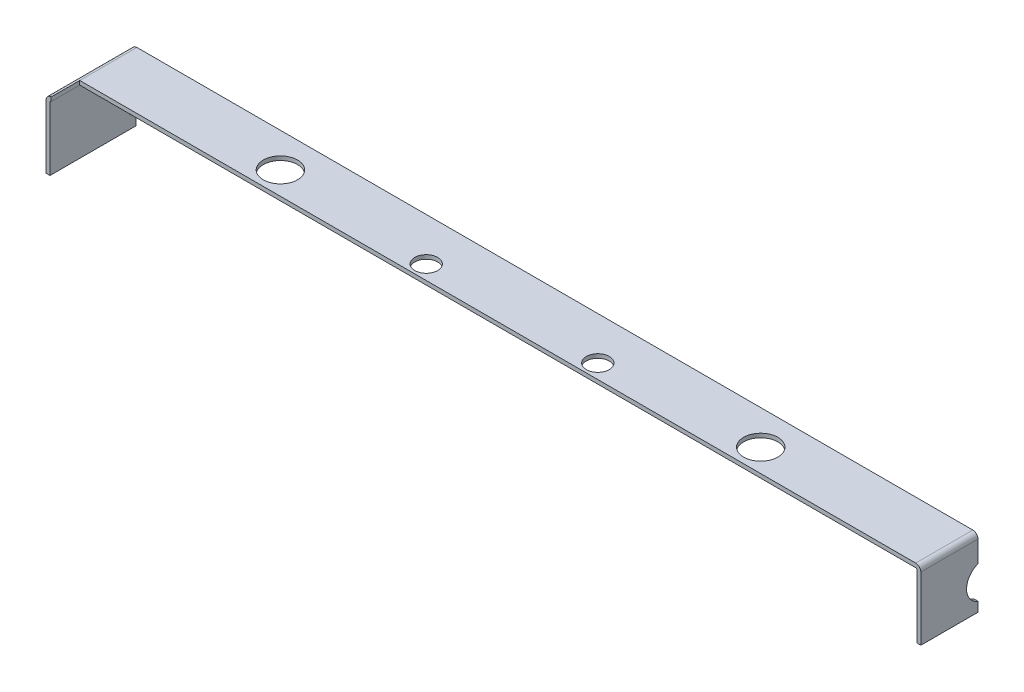
ISO-10303-21;
HEADER;
FILE_DESCRIPTION(('STEP AP214'),'2;1');
FILE_NAME('part.step','',(''),(''),'','','');
FILE_SCHEMA(('AUTOMOTIVE_DESIGN { 1 0 10303 214 1 1 1 1 }'));
ENDSEC;
DATA;
#1=APPLICATION_CONTEXT('core data for automotive mechanical design processes');
#2=APPLICATION_PROTOCOL_DEFINITION('international standard','automotive_design',2000,#1);
#3=PRODUCT_CONTEXT('',#1,'mechanical');
#4=PRODUCT('Part','Part','',(#3));
#5=PRODUCT_RELATED_PRODUCT_CATEGORY('part','',(#4));
#6=PRODUCT_DEFINITION_FORMATION('','',#4);
#7=PRODUCT_DEFINITION_CONTEXT('part definition',#1,'design');
#8=PRODUCT_DEFINITION('design','',#6,#7);
#9=PRODUCT_DEFINITION_SHAPE('','',#8);
#10=(LENGTH_UNIT() NAMED_UNIT(*) SI_UNIT(.MILLI.,.METRE.));
#11=(NAMED_UNIT(*) PLANE_ANGLE_UNIT() SI_UNIT($,.RADIAN.));
#12=(NAMED_UNIT(*) SI_UNIT($,.STERADIAN.) SOLID_ANGLE_UNIT());
#13=UNCERTAINTY_MEASURE_WITH_UNIT(LENGTH_MEASURE(1.E-05),#10,'distance_accuracy_value','');
#14=(GEOMETRIC_REPRESENTATION_CONTEXT(3) GLOBAL_UNCERTAINTY_ASSIGNED_CONTEXT((#13)) GLOBAL_UNIT_ASSIGNED_CONTEXT((#10,
#11,#12)) REPRESENTATION_CONTEXT('',''));
#15=CARTESIAN_POINT('',(0.,0.,0.));
#16=DIRECTION('',(0.,0.,1.));
#17=DIRECTION('',(1.,0.,0.));
#18=AXIS2_PLACEMENT_3D('',#15,#16,#17);
#19=CARTESIAN_POINT('',(-74.,-12.01,-32.));
#20=DIRECTION('',(0.,0.,1.));
#21=DIRECTION('',(1.,0.,0.));
#22=AXIS2_PLACEMENT_3D('',#19,#20,#21);
#23=PLANE('',#22);
#24=DIRECTION('',(0.,1.,0.));
#25=VECTOR('',#24,1.);
#26=CARTESIAN_POINT('',(73.3,1.81762176597924E-13,-32.));
#27=LINE('',#26,#25);
#28=CARTESIAN_POINT('',(73.3,-12.,-32.));
#29=VERTEX_POINT('',#28);
#30=CARTESIAN_POINT('',(73.3,-10.3284271247462,-32.));
#31=VERTEX_POINT('',#30);
#32=EDGE_CURVE('E266',#29,#31,#27,.T.);
#33=ORIENTED_EDGE('',*,*,#32,.T.);
#34=DIRECTION('',(-1.,0.,0.));
#35=VECTOR('',#34,1.);
#36=CARTESIAN_POINT('',(74.,-10.3284271247462,-32.));
#37=LINE('',#36,#35);
#38=CARTESIAN_POINT('',(74.,-10.3284271247462,-32.));
#39=VERTEX_POINT('',#38);
#40=EDGE_CURVE('E271',#31,#39,#37,.F.);
#41=ORIENTED_EDGE('',*,*,#40,.T.);
#42=DIRECTION('',(0.,1.,0.));
#43=VECTOR('',#42,1.);
#44=CARTESIAN_POINT('',(74.,1.84206213535114E-13,-32.));
#45=LINE('',#44,#43);
#46=CARTESIAN_POINT('',(74.,-12.,-32.));
#47=VERTEX_POINT('',#46);
#48=EDGE_CURVE('E249',#47,#39,#45,.T.);
#49=ORIENTED_EDGE('',*,*,#48,.F.);
#50=DIRECTION('',(1.,0.,0.));
#51=VECTOR('',#50,1.);
#52=CARTESIAN_POINT('',(74.,-12.,-32.));
#53=LINE('',#52,#51);
#54=EDGE_CURVE('E244',#29,#47,#53,.T.);
#55=ORIENTED_EDGE('',*,*,#54,.F.);
#56=EDGE_LOOP('',(#33,#41,#49,#55));
#57=FACE_BOUND('',#56,.T.);
#58=ADVANCED_FACE('F35',(#57),#23,.F.);
#59=CARTESIAN_POINT('',(-73.1,-12.01,-17.));
#60=DIRECTION('',(0.,0.,-1.));
#61=DIRECTION('',(-1.,0.,0.));
#62=AXIS2_PLACEMENT_3D('',#59,#60,#61);
#63=PLANE('',#62);
#64=CARTESIAN_POINT('',(-73.1,-0.900000000000013,-17.));
#65=DIRECTION('',(0.,0.,-1.));
#66=DIRECTION('',(-1.,0.,0.));
#67=AXIS2_PLACEMENT_3D('',#64,#65,#66);
#68=CIRCLE('',#67,0.900000000000006);
#69=CARTESIAN_POINT('',(-73.1,0.,-17.));
#70=VERTEX_POINT('',#69);
#71=CARTESIAN_POINT('',(-74.,-0.900000000000009,-17.));
#72=VERTEX_POINT('',#71);
#73=EDGE_CURVE('E277',#70,#72,#68,.F.);
#74=ORIENTED_EDGE('',*,*,#73,.T.);
#75=DIRECTION('',(0.,1.,0.));
#76=VECTOR('',#75,1.);
#77=CARTESIAN_POINT('',(-74.,2.75087301834076E-13,-17.));
#78=LINE('',#77,#76);
#79=CARTESIAN_POINT('',(-74.,-12.,-17.));
#80=VERTEX_POINT('',#79);
#81=EDGE_CURVE('E238',#80,#72,#78,.T.);
#82=ORIENTED_EDGE('',*,*,#81,.F.);
#83=DIRECTION('',(-1.,0.,0.));
#84=VECTOR('',#83,1.);
#85=CARTESIAN_POINT('',(-74.,-12.,-17.));
#86=LINE('',#85,#84);
#87=CARTESIAN_POINT('',(-73.3,-12.,-17.));
#88=VERTEX_POINT('',#87);
#89=EDGE_CURVE('E177',#88,#80,#86,.T.);
#90=ORIENTED_EDGE('',*,*,#89,.F.);
#91=DIRECTION('',(0.,1.,0.));
#92=VECTOR('',#91,1.);
#93=CARTESIAN_POINT('',(-73.3,2.72643264896886E-13,-17.));
#94=LINE('',#93,#92);
#95=CARTESIAN_POINT('',(-73.3,-0.900000000000012,-17.));
#96=VERTEX_POINT('',#95);
#97=EDGE_CURVE('E173',#88,#96,#94,.T.);
#98=ORIENTED_EDGE('',*,*,#97,.T.);
#99=CARTESIAN_POINT('',(-73.1,-0.900000000000013,-17.));
#100=DIRECTION('',(0.,0.,-1.));
#101=DIRECTION('',(-1.,0.,0.));
#102=AXIS2_PLACEMENT_3D('',#99,#100,#101);
#103=CIRCLE('',#102,0.200000000000006);
#104=CARTESIAN_POINT('',(-73.1,-0.700000000000007,-17.));
#105=VERTEX_POINT('',#104);
#106=EDGE_CURVE('E159',#105,#96,#103,.F.);
#107=ORIENTED_EDGE('',*,*,#106,.F.);
#108=DIRECTION('',(0.,1.,0.));
#109=VECTOR('',#108,1.);
#110=CARTESIAN_POINT('',(-73.1,-12.01,-17.));
#111=LINE('',#110,#109);
#112=EDGE_CURVE('E222',#105,#70,#111,.T.);
#113=ORIENTED_EDGE('',*,*,#112,.T.);
#114=EDGE_LOOP('',(#74,#82,#90,#98,#107,#113));
#115=FACE_BOUND('',#114,.T.);
#116=ADVANCED_FACE('F175',(#115),#63,.F.);
#117=CARTESIAN_POINT('',(-73.1,-12.01,-22.));
#118=DIRECTION('',(-1.,0.,0.));
#119=DIRECTION('',(0.,0.,1.));
#120=AXIS2_PLACEMENT_3D('',#117,#118,#119);
#121=PLANE('',#120);
#122=DIRECTION('',(0.,1.,0.));
#123=VECTOR('',#122,1.);
#124=CARTESIAN_POINT('',(-73.1,-12.01,-22.));
#125=LINE('',#124,#123);
#126=CARTESIAN_POINT('',(-73.1,-0.700000000000007,-22.));
#127=VERTEX_POINT('',#126);
#128=CARTESIAN_POINT('',(-73.1,0.,-22.));
#129=VERTEX_POINT('',#128);
#130=EDGE_CURVE('E284',#127,#129,#125,.T.);
#131=ORIENTED_EDGE('',*,*,#130,.T.);
#132=DIRECTION('',(0.,0.,-1.));
#133=VECTOR('',#132,1.);
#134=CARTESIAN_POINT('',(-73.1,0.,-45.));
#135=LINE('',#134,#133);
#136=EDGE_CURVE('E179',#129,#70,#135,.F.);
#137=ORIENTED_EDGE('',*,*,#136,.T.);
#138=ORIENTED_EDGE('',*,*,#112,.F.);
#139=DIRECTION('',(0.,0.,-1.));
#140=VECTOR('',#139,1.);
#141=CARTESIAN_POINT('',(-73.1,-0.700000000000007,-45.));
#142=LINE('',#141,#140);
#143=EDGE_CURVE('E165',#127,#105,#142,.F.);
#144=ORIENTED_EDGE('',*,*,#143,.F.);
#145=EDGE_LOOP('',(#131,#137,#138,#144));
#146=FACE_BOUND('',#145,.T.);
#147=ADVANCED_FACE('F341',(#146),#121,.F.);
#148=CARTESIAN_POINT('',(-73.1,-12.01,-22.));
#149=DIRECTION('',(0.,0.,-1.));
#150=DIRECTION('',(-1.,0.,0.));
#151=AXIS2_PLACEMENT_3D('',#148,#149,#150);
#152=PLANE('',#151);
#153=CARTESIAN_POINT('',(73.1,-0.900000000000012,-22.));
#154=DIRECTION('',(0.,0.,-1.));
#155=DIRECTION('',(-1.,0.,0.));
#156=AXIS2_PLACEMENT_3D('',#153,#154,#155);
#157=CIRCLE('',#156,0.899999999999992);
#158=CARTESIAN_POINT('',(74.,-0.90000000000001,-22.));
#159=VERTEX_POINT('',#158);
#160=CARTESIAN_POINT('',(73.1,0.,-22.));
#161=VERTEX_POINT('',#160);
#162=EDGE_CURVE('E262',#159,#161,#157,.F.);
#163=ORIENTED_EDGE('',*,*,#162,.T.);
#164=DIRECTION('',(-1.,0.,0.));
#165=VECTOR('',#164,1.);
#166=CARTESIAN_POINT('',(0.,0.,-22.));
#167=LINE('',#166,#165);
#168=EDGE_CURVE('E258',#161,#129,#167,.T.);
#169=ORIENTED_EDGE('',*,*,#168,.T.);
#170=ORIENTED_EDGE('',*,*,#130,.F.);
#171=DIRECTION('',(-1.,0.,0.));
#172=VECTOR('',#171,1.);
#173=CARTESIAN_POINT('',(0.,-0.7,-22.));
#174=LINE('',#173,#172);
#175=CARTESIAN_POINT('',(73.1,-0.700000000000021,-22.));
#176=VERTEX_POINT('',#175);
#177=EDGE_CURVE('E253',#176,#127,#174,.T.);
#178=ORIENTED_EDGE('',*,*,#177,.F.);
#179=CARTESIAN_POINT('',(73.1,-0.900000000000012,-22.));
#180=DIRECTION('',(0.,0.,-1.));
#181=DIRECTION('',(-1.,0.,0.));
#182=AXIS2_PLACEMENT_3D('',#179,#180,#181);
#183=CIRCLE('',#182,0.199999999999992);
#184=CARTESIAN_POINT('',(73.3,-0.900000000000012,-22.));
#185=VERTEX_POINT('',#184);
#186=EDGE_CURVE('E252',#185,#176,#183,.F.);
#187=ORIENTED_EDGE('',*,*,#186,.F.);
#188=DIRECTION('',(0.,-1.,0.));
#189=VECTOR('',#188,1.);
#190=CARTESIAN_POINT('',(73.3,1.81762176597924E-13,-22.));
#191=LINE('',#190,#189);
#192=CARTESIAN_POINT('',(73.3,-12.,-22.));
#193=VERTEX_POINT('',#192);
#194=EDGE_CURVE('E267',#185,#193,#191,.T.);
#195=ORIENTED_EDGE('',*,*,#194,.T.);
#196=DIRECTION('',(-1.,0.,0.));
#197=VECTOR('',#196,1.);
#198=CARTESIAN_POINT('',(74.,-12.,-22.));
#199=LINE('',#198,#197);
#200=CARTESIAN_POINT('',(74.,-12.,-22.));
#201=VERTEX_POINT('',#200);
#202=EDGE_CURVE('E243',#201,#193,#199,.T.);
#203=ORIENTED_EDGE('',*,*,#202,.F.);
#204=DIRECTION('',(0.,-1.,0.));
#205=VECTOR('',#204,1.);
#206=CARTESIAN_POINT('',(74.,1.84206213535114E-13,-22.));
#207=LINE('',#206,#205);
#208=EDGE_CURVE('E246',#159,#201,#207,.T.);
#209=ORIENTED_EDGE('',*,*,#208,.F.);
#210=EDGE_LOOP('',(#163,#169,#170,#178,#187,#195,#203,#209));
#211=FACE_BOUND('',#210,.T.);
#212=ADVANCED_FACE('F346',(#211),#152,.F.);
#213=CARTESIAN_POINT('',(73.1,-0.900000000000012,-32.));
#214=DIRECTION('',(0.,0.,1.));
#215=DIRECTION('',(1.,0.,0.));
#216=AXIS2_PLACEMENT_3D('',#213,#214,#215);
#217=CIRCLE('',#216,0.899999999999992);
#218=CARTESIAN_POINT('',(73.1,0.,-32.));
#219=VERTEX_POINT('',#218);
#220=CARTESIAN_POINT('',(74.,-0.90000000000001,-32.));
#221=VERTEX_POINT('',#220);
#222=EDGE_CURVE('E259',#219,#221,#217,.F.);
#223=ORIENTED_EDGE('',*,*,#222,.T.);
#224=CARTESIAN_POINT('',(74.,-4.67157287525381,-32.));
#225=VERTEX_POINT('',#224);
#226=EDGE_CURVE('E247',#225,#221,#45,.T.);
#227=ORIENTED_EDGE('',*,*,#226,.F.);
#228=DIRECTION('',(-1.,0.,0.));
#229=VECTOR('',#228,1.);
#230=CARTESIAN_POINT('',(74.,-4.67157287525381,-32.));
#231=LINE('',#230,#229);
#232=CARTESIAN_POINT('',(73.3,-4.67157287525381,-32.));
#233=VERTEX_POINT('',#232);
#234=EDGE_CURVE('E268',#225,#233,#231,.T.);
#235=ORIENTED_EDGE('',*,*,#234,.T.);
#236=CARTESIAN_POINT('',(73.3,-0.900000000000012,-32.));
#237=VERTEX_POINT('',#236);
#238=EDGE_CURVE('E263',#233,#237,#27,.T.);
#239=ORIENTED_EDGE('',*,*,#238,.T.);
#240=CARTESIAN_POINT('',(73.1,-0.900000000000012,-32.));
#241=DIRECTION('',(0.,0.,1.));
#242=DIRECTION('',(1.,0.,0.));
#243=AXIS2_PLACEMENT_3D('',#240,#241,#242);
#244=CIRCLE('',#243,0.199999999999992);
#245=CARTESIAN_POINT('',(73.1,-0.700000000000021,-32.));
#246=VERTEX_POINT('',#245);
#247=EDGE_CURVE('E250',#246,#237,#244,.F.);
#248=ORIENTED_EDGE('',*,*,#247,.F.);
#249=DIRECTION('',(1.,0.,0.));
#250=VECTOR('',#249,1.);
#251=CARTESIAN_POINT('',(0.,-0.7,-32.));
#252=LINE('',#251,#250);
#253=CARTESIAN_POINT('',(-73.1,-0.700000000000007,-32.));
#254=VERTEX_POINT('',#253);
#255=EDGE_CURVE('E254',#254,#246,#252,.T.);
#256=ORIENTED_EDGE('',*,*,#255,.F.);
#257=CARTESIAN_POINT('',(-73.1,-0.900000000000013,-32.));
#258=DIRECTION('',(0.,0.,1.));
#259=DIRECTION('',(1.,0.,0.));
#260=AXIS2_PLACEMENT_3D('',#257,#258,#259);
#261=CIRCLE('',#260,0.200000000000006);
#262=CARTESIAN_POINT('',(-73.3,-0.900000000000012,-32.));
#263=VERTEX_POINT('',#262);
#264=EDGE_CURVE('E170',#263,#254,#261,.F.);
#265=ORIENTED_EDGE('',*,*,#264,.F.);
#266=DIRECTION('',(0.,-1.,0.));
#267=VECTOR('',#266,1.);
#268=CARTESIAN_POINT('',(-73.3,2.72643264896886E-13,-32.));
#269=LINE('',#268,#267);
#270=CARTESIAN_POINT('',(-73.3,-4.67157287525327,-32.));
#271=VERTEX_POINT('',#270);
#272=EDGE_CURVE('E182',#263,#271,#269,.T.);
#273=ORIENTED_EDGE('',*,*,#272,.T.);
#274=DIRECTION('',(-1.,0.,0.));
#275=VECTOR('',#274,1.);
#276=CARTESIAN_POINT('',(-64.,-4.6715728752533,-32.));
#277=LINE('',#276,#275);
#278=CARTESIAN_POINT('',(-74.,-4.67157287525327,-32.));
#279=VERTEX_POINT('',#278);
#280=EDGE_CURVE('E51',#279,#271,#277,.F.);
#281=ORIENTED_EDGE('',*,*,#280,.F.);
#282=DIRECTION('',(0.,-1.,0.));
#283=VECTOR('',#282,1.);
#284=CARTESIAN_POINT('',(-74.,2.75087301834076E-13,-32.));
#285=LINE('',#284,#283);
#286=CARTESIAN_POINT('',(-74.,-0.900000000000009,-32.));
#287=VERTEX_POINT('',#286);
#288=EDGE_CURVE('E169',#287,#279,#285,.T.);
#289=ORIENTED_EDGE('',*,*,#288,.F.);
#290=CARTESIAN_POINT('',(-73.1,-0.900000000000013,-32.));
#291=DIRECTION('',(0.,0.,1.));
#292=DIRECTION('',(1.,0.,0.));
#293=AXIS2_PLACEMENT_3D('',#290,#291,#292);
#294=CIRCLE('',#293,0.900000000000006);
#295=CARTESIAN_POINT('',(-73.1,0.,-32.));
#296=VERTEX_POINT('',#295);
#297=EDGE_CURVE('E274',#287,#296,#294,.F.);
#298=ORIENTED_EDGE('',*,*,#297,.T.);
#299=DIRECTION('',(1.,0.,0.));
#300=VECTOR('',#299,1.);
#301=CARTESIAN_POINT('',(0.,0.,-32.));
#302=LINE('',#301,#300);
#303=EDGE_CURVE('E256',#296,#219,#302,.T.);
#304=ORIENTED_EDGE('',*,*,#303,.T.);
#305=EDGE_LOOP('',(#223,#227,#235,#239,#248,#256,#265,#273,#281,#289,#298,#304));
#306=FACE_BOUND('',#305,.T.);
#307=ADVANCED_FACE('F314',(#306),#23,.F.);
#308=CARTESIAN_POINT('',(-74.,-10.3284271247457,-32.));
#309=VERTEX_POINT('',#308);
#310=CARTESIAN_POINT('',(-74.,-12.,-32.));
#311=VERTEX_POINT('',#310);
#312=EDGE_CURVE('E239',#309,#311,#285,.T.);
#313=ORIENTED_EDGE('',*,*,#312,.F.);
#314=DIRECTION('',(-1.,0.,0.));
#315=VECTOR('',#314,1.);
#316=CARTESIAN_POINT('',(-64.,-10.3284271247457,-32.));
#317=LINE('',#316,#315);
#318=CARTESIAN_POINT('',(-73.3,-10.3284271247457,-32.));
#319=VERTEX_POINT('',#318);
#320=EDGE_CURVE('E215',#319,#309,#317,.T.);
#321=ORIENTED_EDGE('',*,*,#320,.F.);
#322=CARTESIAN_POINT('',(-73.3,-12.,-32.));
#323=VERTEX_POINT('',#322);
#324=EDGE_CURVE('E59',#319,#323,#269,.T.);
#325=ORIENTED_EDGE('',*,*,#324,.T.);
#326=DIRECTION('',(1.,0.,0.));
#327=VECTOR('',#326,1.);
#328=CARTESIAN_POINT('',(-74.,-12.,-32.));
#329=LINE('',#328,#327);
#330=EDGE_CURVE('E236',#311,#323,#329,.T.);
#331=ORIENTED_EDGE('',*,*,#330,.F.);
#332=EDGE_LOOP('',(#313,#321,#325,#331));
#333=FACE_BOUND('',#332,.T.);
#334=ADVANCED_FACE('F319',(#333),#23,.F.);
#335=CARTESIAN_POINT('',(0.,0.,0.));
#336=DIRECTION('',(0.,1.,0.));
#337=DIRECTION('',(0.,0.,1.));
#338=AXIS2_PLACEMENT_3D('',#335,#336,#337);
#339=PLANE('',#338);
#340=CARTESIAN_POINT('',(-15.,0.,-24.5));
#341=DIRECTION('',(0.,1.,0.));
#342=DIRECTION('',(0.,0.,1.));
#343=AXIS2_PLACEMENT_3D('',#340,#341,#342);
#344=CIRCLE('',#343,2.);
#345=CARTESIAN_POINT('',(-15.,0.,-22.5));
#346=VERTEX_POINT('',#345);
#347=EDGE_CURVE('E229',#346,#346,#344,.T.);
#348=ORIENTED_EDGE('',*,*,#347,.F.);
#349=EDGE_LOOP('',(#348));
#350=FACE_BOUND('',#349,.T.);
#351=CARTESIAN_POINT('',(15.,0.,-24.4999999999999));
#352=DIRECTION('',(0.,1.,0.));
#353=DIRECTION('',(0.,0.,1.));
#354=AXIS2_PLACEMENT_3D('',#351,#352,#353);
#355=CIRCLE('',#354,2.);
#356=CARTESIAN_POINT('',(15.,0.,-22.4999999999999));
#357=VERTEX_POINT('',#356);
#358=EDGE_CURVE('E524',#357,#357,#355,.T.);
#359=ORIENTED_EDGE('',*,*,#358,.F.);
#360=EDGE_LOOP('',(#359));
#361=FACE_BOUND('',#360,.T.);
#362=CARTESIAN_POINT('',(-42.,0.,-26.));
#363=DIRECTION('',(0.,1.,0.));
#364=DIRECTION('',(0.,0.,1.));
#365=AXIS2_PLACEMENT_3D('',#362,#363,#364);
#366=CIRCLE('',#365,3.);
#367=CARTESIAN_POINT('',(-42.,0.,-23.));
#368=VERTEX_POINT('',#367);
#369=EDGE_CURVE('E218',#368,#368,#366,.T.);
#370=ORIENTED_EDGE('',*,*,#369,.F.);
#371=EDGE_LOOP('',(#370));
#372=FACE_BOUND('',#371,.T.);
#373=CARTESIAN_POINT('',(42.,0.,-25.9999999999999));
#374=DIRECTION('',(0.,1.,0.));
#375=DIRECTION('',(0.,0.,-1.));
#376=AXIS2_PLACEMENT_3D('',#373,#374,#375);
#377=CIRCLE('',#376,3.);
#378=CARTESIAN_POINT('',(42.,0.,-28.9999999999999));
#379=VERTEX_POINT('',#378);
#380=EDGE_CURVE('E224',#379,#379,#377,.T.);
#381=ORIENTED_EDGE('',*,*,#380,.F.);
#382=EDGE_LOOP('',(#381));
#383=FACE_BOUND('',#382,.T.);
#384=ORIENTED_EDGE('',*,*,#303,.F.);
#385=EDGE_CURVE('E195',#296,#129,#135,.F.);
#386=ORIENTED_EDGE('',*,*,#385,.T.);
#387=ORIENTED_EDGE('',*,*,#168,.F.);
#388=DIRECTION('',(0.,0.,1.));
#389=VECTOR('',#388,1.);
#390=CARTESIAN_POINT('',(73.1,0.,45.));
#391=LINE('',#390,#389);
#392=EDGE_CURVE('E213',#161,#219,#391,.F.);
#393=ORIENTED_EDGE('',*,*,#392,.T.);
#394=EDGE_LOOP('',(#384,#386,#387,#393));
#395=FACE_BOUND('',#394,.T.);
#396=ADVANCED_FACE('F348',(#350,#361,#372,#383,#395),#339,.T.);
#397=CARTESIAN_POINT('',(0.,-0.7,0.));
#398=DIRECTION('',(0.,1.,0.));
#399=DIRECTION('',(0.,0.,1.));
#400=AXIS2_PLACEMENT_3D('',#397,#398,#399);
#401=PLANE('',#400);
#402=CARTESIAN_POINT('',(-15.,-0.7,-24.5));
#403=DIRECTION('',(0.,-1.,0.));
#404=DIRECTION('',(0.,0.,-1.));
#405=AXIS2_PLACEMENT_3D('',#402,#403,#404);
#406=CIRCLE('',#405,2.);
#407=CARTESIAN_POINT('',(-15.,-0.7,-26.5));
#408=VERTEX_POINT('',#407);
#409=EDGE_CURVE('E523',#408,#408,#406,.T.);
#410=ORIENTED_EDGE('',*,*,#409,.F.);
#411=EDGE_LOOP('',(#410));
#412=FACE_BOUND('',#411,.T.);
#413=CARTESIAN_POINT('',(15.,-0.7,-24.4999999999999));
#414=DIRECTION('',(0.,-1.,0.));
#415=DIRECTION('',(0.,0.,1.));
#416=AXIS2_PLACEMENT_3D('',#413,#414,#415);
#417=CIRCLE('',#416,2.);
#418=CARTESIAN_POINT('',(15.,-0.7,-22.4999999999999));
#419=VERTEX_POINT('',#418);
#420=EDGE_CURVE('E525',#419,#419,#417,.T.);
#421=ORIENTED_EDGE('',*,*,#420,.F.);
#422=EDGE_LOOP('',(#421));
#423=FACE_BOUND('',#422,.T.);
#424=CARTESIAN_POINT('',(-42.,-0.699999999999999,-26.));
#425=DIRECTION('',(0.,1.,0.));
#426=DIRECTION('',(0.,0.,1.));
#427=AXIS2_PLACEMENT_3D('',#424,#425,#426);
#428=CIRCLE('',#427,3.);
#429=CARTESIAN_POINT('',(-42.,-0.699999999999999,-23.));
#430=VERTEX_POINT('',#429);
#431=EDGE_CURVE('E39',#430,#430,#428,.T.);
#432=ORIENTED_EDGE('',*,*,#431,.T.);
#433=EDGE_LOOP('',(#432));
#434=FACE_BOUND('',#433,.T.);
#435=CARTESIAN_POINT('',(42.,-0.699999999999999,-25.9999999999999));
#436=DIRECTION('',(0.,1.,0.));
#437=DIRECTION('',(0.,0.,1.));
#438=AXIS2_PLACEMENT_3D('',#435,#436,#437);
#439=CIRCLE('',#438,3.);
#440=CARTESIAN_POINT('',(42.,-0.699999999999999,-22.9999999999999));
#441=VERTEX_POINT('',#440);
#442=EDGE_CURVE('E216',#441,#441,#439,.T.);
#443=ORIENTED_EDGE('',*,*,#442,.T.);
#444=EDGE_LOOP('',(#443));
#445=FACE_BOUND('',#444,.T.);
#446=EDGE_CURVE('E193',#254,#127,#142,.F.);
#447=ORIENTED_EDGE('',*,*,#446,.F.);
#448=ORIENTED_EDGE('',*,*,#255,.T.);
#449=DIRECTION('',(0.,0.,1.));
#450=VECTOR('',#449,1.);
#451=CARTESIAN_POINT('',(73.1,-0.700000000000021,45.));
#452=LINE('',#451,#450);
#453=EDGE_CURVE('E210',#176,#246,#452,.F.);
#454=ORIENTED_EDGE('',*,*,#453,.F.);
#455=ORIENTED_EDGE('',*,*,#177,.T.);
#456=EDGE_LOOP('',(#447,#448,#454,#455));
#457=FACE_BOUND('',#456,.T.);
#458=ADVANCED_FACE('F352',(#412,#423,#434,#445,#457),#401,.F.);
#459=CARTESIAN_POINT('',(-73.1,-0.900000000000013,-45.));
#460=DIRECTION('',(0.,0.,-1.));
#461=DIRECTION('',(-1.,0.,0.));
#462=AXIS2_PLACEMENT_3D('',#459,#460,#461);
#463=CYLINDRICAL_SURFACE('',#462,0.900000000000006);
#464=ORIENTED_EDGE('',*,*,#297,.F.);
#465=DIRECTION('',(0.,0.,-1.));
#466=VECTOR('',#465,1.);
#467=CARTESIAN_POINT('',(-74.,-0.900000000000009,45.));
#468=LINE('',#467,#466);
#469=EDGE_CURVE('E184',#287,#72,#468,.F.);
#470=ORIENTED_EDGE('',*,*,#469,.T.);
#471=ORIENTED_EDGE('',*,*,#73,.F.);
#472=ORIENTED_EDGE('',*,*,#136,.F.);
#473=ORIENTED_EDGE('',*,*,#385,.F.);
#474=EDGE_LOOP('',(#464,#470,#471,#472,#473));
#475=FACE_BOUND('',#474,.T.);
#476=ADVANCED_FACE('F310',(#475),#463,.T.);
#477=CARTESIAN_POINT('',(-73.1,-0.900000000000013,-45.));
#478=DIRECTION('',(0.,0.,-1.));
#479=DIRECTION('',(-1.,0.,0.));
#480=AXIS2_PLACEMENT_3D('',#477,#478,#479);
#481=CYLINDRICAL_SURFACE('',#480,0.200000000000006);
#482=DIRECTION('',(0.,0.,-1.));
#483=VECTOR('',#482,1.);
#484=CARTESIAN_POINT('',(-73.3,-0.900000000000012,45.));
#485=LINE('',#484,#483);
#486=EDGE_CURVE('E163',#96,#263,#485,.T.);
#487=ORIENTED_EDGE('',*,*,#486,.T.);
#488=ORIENTED_EDGE('',*,*,#264,.T.);
#489=ORIENTED_EDGE('',*,*,#446,.T.);
#490=ORIENTED_EDGE('',*,*,#143,.T.);
#491=ORIENTED_EDGE('',*,*,#106,.T.);
#492=EDGE_LOOP('',(#487,#488,#489,#490,#491));
#493=FACE_BOUND('',#492,.T.);
#494=ADVANCED_FACE('F161',(#493),#481,.F.);
#495=CARTESIAN_POINT('',(-73.3,2.72643264896886E-13,0.));
#496=DIRECTION('',(1.,0.,0.));
#497=DIRECTION('',(0.,1.,0.));
#498=AXIS2_PLACEMENT_3D('',#495,#496,#497);
#499=PLANE('',#498);
#500=ORIENTED_EDGE('',*,*,#272,.F.);
#501=ORIENTED_EDGE('',*,*,#486,.F.);
#502=ORIENTED_EDGE('',*,*,#97,.F.);
#503=DIRECTION('',(0.,0.,-1.));
#504=VECTOR('',#503,1.);
#505=CARTESIAN_POINT('',(-73.3,-12.,45.));
#506=LINE('',#505,#504);
#507=EDGE_CURVE('E188',#323,#88,#506,.F.);
#508=ORIENTED_EDGE('',*,*,#507,.F.);
#509=ORIENTED_EDGE('',*,*,#324,.F.);
#510=CARTESIAN_POINT('',(-73.3,-7.49999999999946,-33.));
#511=DIRECTION('',(1.,0.,0.));
#512=DIRECTION('',(0.,1.,0.));
#513=AXIS2_PLACEMENT_3D('',#510,#511,#512);
#514=CIRCLE('',#513,3.);
#515=EDGE_CURVE('E44',#271,#319,#514,.T.);
#516=ORIENTED_EDGE('',*,*,#515,.F.);
#517=EDGE_LOOP('',(#500,#501,#502,#508,#509,#516));
#518=FACE_BOUND('',#517,.T.);
#519=ADVANCED_FACE('F181',(#518),#499,.T.);
#520=CARTESIAN_POINT('',(-74.,2.75087301834076E-13,0.));
#521=DIRECTION('',(1.,0.,0.));
#522=DIRECTION('',(0.,1.,0.));
#523=AXIS2_PLACEMENT_3D('',#520,#521,#522);
#524=PLANE('',#523);
#525=ORIENTED_EDGE('',*,*,#469,.F.);
#526=ORIENTED_EDGE('',*,*,#288,.T.);
#527=CARTESIAN_POINT('',(-74.,-7.49999999999946,-33.));
#528=DIRECTION('',(-1.,0.,0.));
#529=DIRECTION('',(0.,-1.,0.));
#530=AXIS2_PLACEMENT_3D('',#527,#528,#529);
#531=CIRCLE('',#530,3.);
#532=EDGE_CURVE('E11',#309,#279,#531,.T.);
#533=ORIENTED_EDGE('',*,*,#532,.F.);
#534=ORIENTED_EDGE('',*,*,#312,.T.);
#535=DIRECTION('',(0.,0.,1.));
#536=VECTOR('',#535,1.);
#537=CARTESIAN_POINT('',(-74.,-12.,0.));
#538=LINE('',#537,#536);
#539=EDGE_CURVE('E288',#311,#80,#538,.T.);
#540=ORIENTED_EDGE('',*,*,#539,.T.);
#541=ORIENTED_EDGE('',*,*,#81,.T.);
#542=EDGE_LOOP('',(#525,#526,#533,#534,#540,#541));
#543=FACE_BOUND('',#542,.T.);
#544=ADVANCED_FACE('F306',(#543),#524,.F.);
#545=CARTESIAN_POINT('',(-64.,-7.49999999999949,-33.));
#546=DIRECTION('',(-1.,0.,0.));
#547=DIRECTION('',(0.,-1.,0.));
#548=AXIS2_PLACEMENT_3D('',#545,#546,#547);
#549=CYLINDRICAL_SURFACE('',#548,3.);
#550=ORIENTED_EDGE('',*,*,#532,.T.);
#551=ORIENTED_EDGE('',*,*,#280,.T.);
#552=ORIENTED_EDGE('',*,*,#515,.T.);
#553=ORIENTED_EDGE('',*,*,#320,.T.);
#554=EDGE_LOOP('',(#550,#551,#552,#553));
#555=FACE_BOUND('',#554,.T.);
#556=ADVANCED_FACE('F317',(#555),#549,.F.);
#557=CARTESIAN_POINT('',(-74.,-12.,45.));
#558=DIRECTION('',(0.,1.,0.));
#559=DIRECTION('',(-1.,0.,0.));
#560=AXIS2_PLACEMENT_3D('',#557,#558,#559);
#561=PLANE('',#560);
#562=ORIENTED_EDGE('',*,*,#539,.F.);
#563=ORIENTED_EDGE('',*,*,#330,.T.);
#564=ORIENTED_EDGE('',*,*,#507,.T.);
#565=ORIENTED_EDGE('',*,*,#89,.T.);
#566=EDGE_LOOP('',(#562,#563,#564,#565));
#567=FACE_BOUND('',#566,.T.);
#568=ADVANCED_FACE('F321',(#567),#561,.F.);
#569=CARTESIAN_POINT('',(73.1,-0.900000000000012,45.));
#570=DIRECTION('',(0.,0.,1.));
#571=DIRECTION('',(1.,0.,0.));
#572=AXIS2_PLACEMENT_3D('',#569,#570,#571);
#573=CYLINDRICAL_SURFACE('',#572,0.899999999999992);
#574=ORIENTED_EDGE('',*,*,#222,.F.);
#575=ORIENTED_EDGE('',*,*,#392,.F.);
#576=ORIENTED_EDGE('',*,*,#162,.F.);
#577=DIRECTION('',(0.,0.,1.));
#578=VECTOR('',#577,1.);
#579=CARTESIAN_POINT('',(74.,-0.90000000000001,-45.));
#580=LINE('',#579,#578);
#581=EDGE_CURVE('E199',#159,#221,#580,.F.);
#582=ORIENTED_EDGE('',*,*,#581,.T.);
#583=EDGE_LOOP('',(#574,#575,#576,#582));
#584=FACE_BOUND('',#583,.T.);
#585=ADVANCED_FACE('F323',(#584),#573,.T.);
#586=CARTESIAN_POINT('',(73.1,-0.900000000000012,45.));
#587=DIRECTION('',(0.,0.,1.));
#588=DIRECTION('',(1.,0.,0.));
#589=AXIS2_PLACEMENT_3D('',#586,#587,#588);
#590=CYLINDRICAL_SURFACE('',#589,0.199999999999992);
#591=ORIENTED_EDGE('',*,*,#453,.T.);
#592=ORIENTED_EDGE('',*,*,#247,.T.);
#593=DIRECTION('',(0.,0.,1.));
#594=VECTOR('',#593,1.);
#595=CARTESIAN_POINT('',(73.3,-0.900000000000012,-45.));
#596=LINE('',#595,#594);
#597=EDGE_CURVE('E198',#237,#185,#596,.T.);
#598=ORIENTED_EDGE('',*,*,#597,.T.);
#599=ORIENTED_EDGE('',*,*,#186,.T.);
#600=EDGE_LOOP('',(#591,#592,#598,#599));
#601=FACE_BOUND('',#600,.T.);
#602=ADVANCED_FACE('F329',(#601),#590,.F.);
#603=CARTESIAN_POINT('',(73.3,1.81762176597924E-13,0.));
#604=DIRECTION('',(-1.,0.,0.));
#605=DIRECTION('',(0.,-1.,0.));
#606=AXIS2_PLACEMENT_3D('',#603,#604,#605);
#607=PLANE('',#606);
#608=ORIENTED_EDGE('',*,*,#32,.F.);
#609=DIRECTION('',(0.,0.,1.));
#610=VECTOR('',#609,1.);
#611=CARTESIAN_POINT('',(73.3,-12.,-45.));
#612=LINE('',#611,#610);
#613=EDGE_CURVE('E203',#193,#29,#612,.F.);
#614=ORIENTED_EDGE('',*,*,#613,.F.);
#615=ORIENTED_EDGE('',*,*,#194,.F.);
#616=ORIENTED_EDGE('',*,*,#597,.F.);
#617=ORIENTED_EDGE('',*,*,#238,.F.);
#618=CARTESIAN_POINT('',(73.3,-7.5,-33.));
#619=DIRECTION('',(-1.,0.,0.));
#620=DIRECTION('',(0.,-1.,0.));
#621=AXIS2_PLACEMENT_3D('',#618,#619,#620);
#622=CIRCLE('',#621,3.);
#623=EDGE_CURVE('E202',#233,#31,#622,.F.);
#624=ORIENTED_EDGE('',*,*,#623,.T.);
#625=EDGE_LOOP('',(#608,#614,#615,#616,#617,#624));
#626=FACE_BOUND('',#625,.T.);
#627=ADVANCED_FACE('F374',(#626),#607,.T.);
#628=CARTESIAN_POINT('',(74.,1.84206213535114E-13,0.));
#629=DIRECTION('',(-1.,0.,0.));
#630=DIRECTION('',(0.,-1.,0.));
#631=AXIS2_PLACEMENT_3D('',#628,#629,#630);
#632=PLANE('',#631);
#633=DIRECTION('',(0.,0.,-1.));
#634=VECTOR('',#633,1.);
#635=CARTESIAN_POINT('',(74.,-12.,0.));
#636=LINE('',#635,#634);
#637=EDGE_CURVE('E207',#201,#47,#636,.T.);
#638=ORIENTED_EDGE('',*,*,#637,.T.);
#639=ORIENTED_EDGE('',*,*,#48,.T.);
#640=CARTESIAN_POINT('',(74.,-7.5,-33.));
#641=DIRECTION('',(-1.,0.,0.));
#642=DIRECTION('',(0.,-1.,0.));
#643=AXIS2_PLACEMENT_3D('',#640,#641,#642);
#644=CIRCLE('',#643,3.);
#645=EDGE_CURVE('E206',#225,#39,#644,.F.);
#646=ORIENTED_EDGE('',*,*,#645,.F.);
#647=ORIENTED_EDGE('',*,*,#226,.T.);
#648=ORIENTED_EDGE('',*,*,#581,.F.);
#649=ORIENTED_EDGE('',*,*,#208,.T.);
#650=EDGE_LOOP('',(#638,#639,#646,#647,#648,#649));
#651=FACE_BOUND('',#650,.T.);
#652=ADVANCED_FACE('F365',(#651),#632,.F.);
#653=CARTESIAN_POINT('',(74.,-7.5,-33.));
#654=DIRECTION('',(-1.,0.,0.));
#655=DIRECTION('',(0.,-1.,0.));
#656=AXIS2_PLACEMENT_3D('',#653,#654,#655);
#657=CYLINDRICAL_SURFACE('',#656,3.);
#658=ORIENTED_EDGE('',*,*,#234,.F.);
#659=ORIENTED_EDGE('',*,*,#645,.T.);
#660=ORIENTED_EDGE('',*,*,#40,.F.);
#661=ORIENTED_EDGE('',*,*,#623,.F.);
#662=EDGE_LOOP('',(#658,#659,#660,#661));
#663=FACE_BOUND('',#662,.T.);
#664=ADVANCED_FACE('F357',(#663),#657,.F.);
#665=CARTESIAN_POINT('',(74.,-12.,-45.));
#666=DIRECTION('',(0.,1.,0.));
#667=DIRECTION('',(-1.,0.,0.));
#668=AXIS2_PLACEMENT_3D('',#665,#666,#667);
#669=PLANE('',#668);
#670=ORIENTED_EDGE('',*,*,#613,.T.);
#671=ORIENTED_EDGE('',*,*,#54,.T.);
#672=ORIENTED_EDGE('',*,*,#637,.F.);
#673=ORIENTED_EDGE('',*,*,#202,.T.);
#674=EDGE_LOOP('',(#670,#671,#672,#673));
#675=FACE_BOUND('',#674,.T.);
#676=ADVANCED_FACE('F37',(#675),#669,.F.);
#677=CARTESIAN_POINT('',(42.,-10.,-25.9999999999999));
#678=DIRECTION('',(0.,1.,0.));
#679=DIRECTION('',(0.,0.,1.));
#680=AXIS2_PLACEMENT_3D('',#677,#678,#679);
#681=CYLINDRICAL_SURFACE('',#680,3.);
#682=ORIENTED_EDGE('',*,*,#380,.T.);
#683=EDGE_LOOP('',(#682));
#684=FACE_BOUND('',#683,.T.);
#685=ORIENTED_EDGE('',*,*,#442,.F.);
#686=EDGE_LOOP('',(#685));
#687=FACE_BOUND('',#686,.T.);
#688=ADVANCED_FACE('F355',(#684,#687),#681,.F.);
#689=CARTESIAN_POINT('',(-42.,-10.,-26.));
#690=DIRECTION('',(0.,1.,0.));
#691=DIRECTION('',(0.,0.,1.));
#692=AXIS2_PLACEMENT_3D('',#689,#690,#691);
#693=CYLINDRICAL_SURFACE('',#692,3.);
#694=ORIENTED_EDGE('',*,*,#369,.T.);
#695=EDGE_LOOP('',(#694));
#696=FACE_BOUND('',#695,.T.);
#697=ORIENTED_EDGE('',*,*,#431,.F.);
#698=EDGE_LOOP('',(#697));
#699=FACE_BOUND('',#698,.T.);
#700=ADVANCED_FACE('F363',(#696,#699),#693,.F.);
#701=CARTESIAN_POINT('',(15.,9.3,-24.4999999999999));
#702=DIRECTION('',(0.,-1.,0.));
#703=DIRECTION('',(0.,0.,-1.));
#704=AXIS2_PLACEMENT_3D('',#701,#702,#703);
#705=CYLINDRICAL_SURFACE('',#704,2.);
#706=ORIENTED_EDGE('',*,*,#358,.T.);
#707=EDGE_LOOP('',(#706));
#708=FACE_BOUND('',#707,.T.);
#709=ORIENTED_EDGE('',*,*,#420,.T.);
#710=EDGE_LOOP('',(#709));
#711=FACE_BOUND('',#710,.T.);
#712=ADVANCED_FACE('F482',(#708,#711),#705,.F.);
#713=CARTESIAN_POINT('',(-15.,9.3,-24.5));
#714=DIRECTION('',(0.,-1.,0.));
#715=DIRECTION('',(0.,0.,-1.));
#716=AXIS2_PLACEMENT_3D('',#713,#714,#715);
#717=CYLINDRICAL_SURFACE('',#716,2.);
#718=ORIENTED_EDGE('',*,*,#347,.T.);
#719=EDGE_LOOP('',(#718));
#720=FACE_BOUND('',#719,.T.);
#721=ORIENTED_EDGE('',*,*,#409,.T.);
#722=EDGE_LOOP('',(#721));
#723=FACE_BOUND('',#722,.T.);
#724=ADVANCED_FACE('F505',(#720,#723),#717,.F.);
#725=CLOSED_SHELL('',(#58,#116,#147,#212,#307,#334,#396,#458,#476,#494,#519,#544,#556,#568,#585,
#602,#627,#652,#664,#676,#688,#700,#712,#724));
#726=MANIFOLD_SOLID_BREP('B2',#725);
#727=ADVANCED_BREP_SHAPE_REPRESENTATION('',(#18,#726),#14);
#728=SHAPE_DEFINITION_REPRESENTATION(#9,#727);
ENDSEC;
END-ISO-10303-21;
